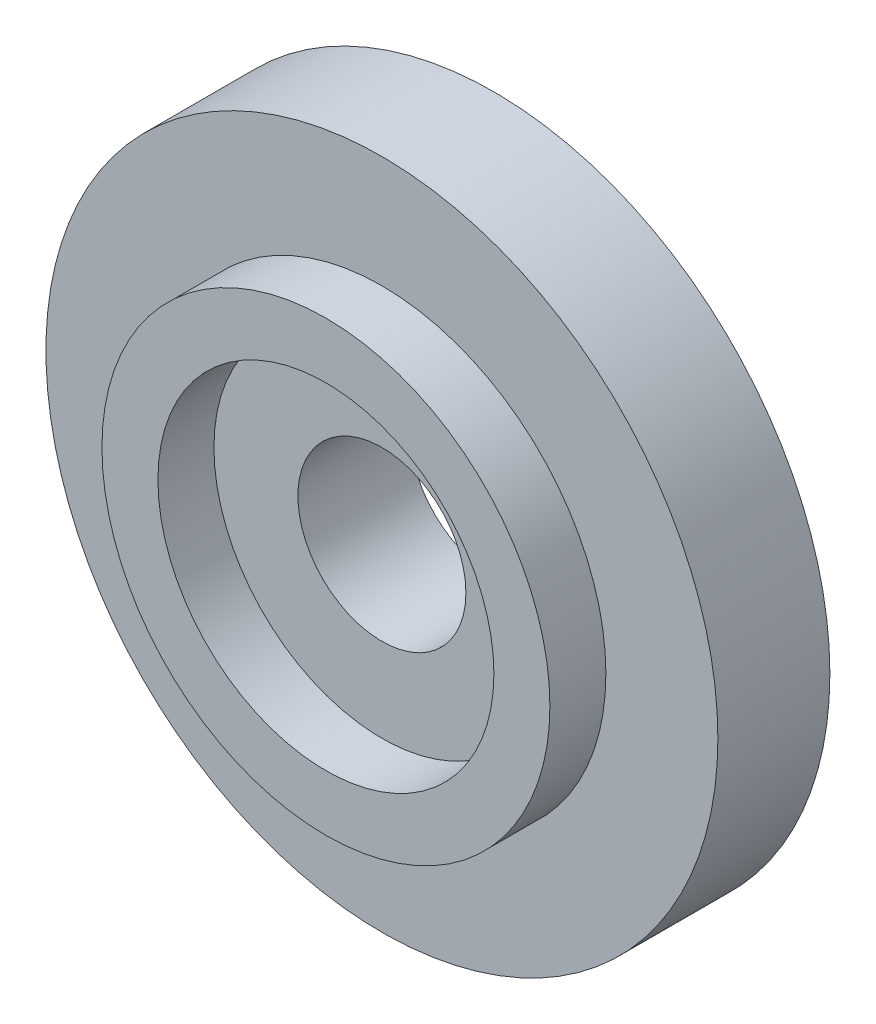
ISO-10303-21;
HEADER;
FILE_DESCRIPTION(('STEP AP214'),'2;1');
FILE_NAME('part.step','',(''),(''),'','','');
FILE_SCHEMA(('AUTOMOTIVE_DESIGN { 1 0 10303 214 1 1 1 1 }'));
ENDSEC;
DATA;
#1=APPLICATION_CONTEXT('core data for automotive mechanical design processes');
#2=APPLICATION_PROTOCOL_DEFINITION('international standard','automotive_design',2000,#1);
#3=PRODUCT_CONTEXT('',#1,'mechanical');
#4=PRODUCT('Part','Part','',(#3));
#5=PRODUCT_RELATED_PRODUCT_CATEGORY('part','',(#4));
#6=PRODUCT_DEFINITION_FORMATION('','',#4);
#7=PRODUCT_DEFINITION_CONTEXT('part definition',#1,'design');
#8=PRODUCT_DEFINITION('design','',#6,#7);
#9=PRODUCT_DEFINITION_SHAPE('','',#8);
#10=(LENGTH_UNIT() NAMED_UNIT(*) SI_UNIT(.MILLI.,.METRE.));
#11=(NAMED_UNIT(*) PLANE_ANGLE_UNIT() SI_UNIT($,.RADIAN.));
#12=(NAMED_UNIT(*) SI_UNIT($,.STERADIAN.) SOLID_ANGLE_UNIT());
#13=UNCERTAINTY_MEASURE_WITH_UNIT(LENGTH_MEASURE(1.E-05),#10,'distance_accuracy_value','');
#14=(GEOMETRIC_REPRESENTATION_CONTEXT(3) GLOBAL_UNCERTAINTY_ASSIGNED_CONTEXT((#13)) GLOBAL_UNIT_ASSIGNED_CONTEXT((#10,
#11,#12)) REPRESENTATION_CONTEXT('',''));
#15=CARTESIAN_POINT('',(0.,0.,0.));
#16=DIRECTION('',(0.,0.,1.));
#17=DIRECTION('',(1.,0.,0.));
#18=AXIS2_PLACEMENT_3D('',#15,#16,#17);
#19=CARTESIAN_POINT('',(0.,0.,2.));
#20=DIRECTION('',(0.,0.,1.));
#21=DIRECTION('',(1.,0.,0.));
#22=AXIS2_PLACEMENT_3D('',#19,#20,#21);
#23=PLANE('',#22);
#24=CARTESIAN_POINT('',(0.,0.,2.));
#25=DIRECTION('',(0.,0.,1.));
#26=DIRECTION('',(1.,0.,0.));
#27=AXIS2_PLACEMENT_3D('',#24,#25,#26);
#28=CIRCLE('',#27,6.);
#29=CARTESIAN_POINT('',(6.,0.,2.));
#30=VERTEX_POINT('',#29);
#31=EDGE_CURVE('E40',#30,#30,#28,.T.);
#32=ORIENTED_EDGE('',*,*,#31,.T.);
#33=EDGE_LOOP('',(#32));
#34=FACE_BOUND('',#33,.T.);
#35=CARTESIAN_POINT('',(0.,0.,2.));
#36=DIRECTION('',(0.,0.,1.));
#37=DIRECTION('',(1.,0.,0.));
#38=AXIS2_PLACEMENT_3D('',#35,#36,#37);
#39=CIRCLE('',#38,4.);
#40=CARTESIAN_POINT('',(4.,0.,2.));
#41=VERTEX_POINT('',#40);
#42=EDGE_CURVE('E57',#41,#41,#39,.T.);
#43=ORIENTED_EDGE('',*,*,#42,.F.);
#44=EDGE_LOOP('',(#43));
#45=FACE_BOUND('',#44,.T.);
#46=ADVANCED_FACE('F33',(#34,#45),#23,.T.);
#47=CARTESIAN_POINT('',(0.,0.,2.));
#48=DIRECTION('',(0.,0.,1.));
#49=DIRECTION('',(1.,0.,0.));
#50=AXIS2_PLACEMENT_3D('',#47,#48,#49);
#51=CIRCLE('',#50,3.);
#52=CARTESIAN_POINT('',(3.,0.,2.));
#53=VERTEX_POINT('',#52);
#54=EDGE_CURVE('E10',#53,#53,#51,.F.);
#55=ORIENTED_EDGE('',*,*,#54,.F.);
#56=EDGE_LOOP('',(#55));
#57=FACE_BOUND('',#56,.T.);
#58=CARTESIAN_POINT('',(0.,0.,2.));
#59=DIRECTION('',(0.,0.,1.));
#60=DIRECTION('',(1.,0.,0.));
#61=AXIS2_PLACEMENT_3D('',#58,#59,#60);
#62=CIRCLE('',#61,1.5);
#63=CARTESIAN_POINT('',(1.5,0.,2.));
#64=VERTEX_POINT('',#63);
#65=EDGE_CURVE('E49',#64,#64,#62,.T.);
#66=ORIENTED_EDGE('',*,*,#65,.F.);
#67=EDGE_LOOP('',(#66));
#68=FACE_BOUND('',#67,.T.);
#69=ADVANCED_FACE('F84',(#57,#68),#23,.T.);
#70=CARTESIAN_POINT('',(0.,0.,0.));
#71=DIRECTION('',(0.,0.,1.));
#72=DIRECTION('',(1.,0.,0.));
#73=AXIS2_PLACEMENT_3D('',#70,#71,#72);
#74=PLANE('',#73);
#75=CARTESIAN_POINT('',(0.,0.,0.));
#76=DIRECTION('',(0.,0.,1.));
#77=DIRECTION('',(1.,0.,0.));
#78=AXIS2_PLACEMENT_3D('',#75,#76,#77);
#79=CIRCLE('',#78,6.);
#80=CARTESIAN_POINT('',(6.,0.,0.));
#81=VERTEX_POINT('',#80);
#82=EDGE_CURVE('E44',#81,#81,#79,.T.);
#83=ORIENTED_EDGE('',*,*,#82,.F.);
#84=EDGE_LOOP('',(#83));
#85=FACE_BOUND('',#84,.T.);
#86=CARTESIAN_POINT('',(0.,0.,0.));
#87=DIRECTION('',(0.,0.,1.));
#88=DIRECTION('',(1.,0.,0.));
#89=AXIS2_PLACEMENT_3D('',#86,#87,#88);
#90=CIRCLE('',#89,1.5);
#91=CARTESIAN_POINT('',(1.5,0.,0.));
#92=VERTEX_POINT('',#91);
#93=EDGE_CURVE('E51',#92,#92,#90,.T.);
#94=ORIENTED_EDGE('',*,*,#93,.T.);
#95=EDGE_LOOP('',(#94));
#96=FACE_BOUND('',#95,.T.);
#97=ADVANCED_FACE('F89',(#85,#96),#74,.F.);
#98=CARTESIAN_POINT('',(0.,0.,2.));
#99=DIRECTION('',(0.,0.,-1.));
#100=DIRECTION('',(-1.,0.,0.));
#101=AXIS2_PLACEMENT_3D('',#98,#99,#100);
#102=CYLINDRICAL_SURFACE('',#101,6.);
#103=ORIENTED_EDGE('',*,*,#31,.F.);
#104=EDGE_LOOP('',(#103));
#105=FACE_BOUND('',#104,.T.);
#106=ORIENTED_EDGE('',*,*,#82,.T.);
#107=EDGE_LOOP('',(#106));
#108=FACE_BOUND('',#107,.T.);
#109=ADVANCED_FACE('F35',(#105,#108),#102,.T.);
#110=CARTESIAN_POINT('',(0.,0.,2.));
#111=DIRECTION('',(0.,0.,-1.));
#112=DIRECTION('',(-1.,0.,0.));
#113=AXIS2_PLACEMENT_3D('',#110,#111,#112);
#114=CYLINDRICAL_SURFACE('',#113,1.5);
#115=ORIENTED_EDGE('',*,*,#65,.T.);
#116=EDGE_LOOP('',(#115));
#117=FACE_BOUND('',#116,.T.);
#118=ORIENTED_EDGE('',*,*,#93,.F.);
#119=EDGE_LOOP('',(#118));
#120=FACE_BOUND('',#119,.T.);
#121=ADVANCED_FACE('F71',(#117,#120),#114,.F.);
#122=CARTESIAN_POINT('',(0.,0.,3.));
#123=DIRECTION('',(0.,0.,1.));
#124=DIRECTION('',(1.,0.,0.));
#125=AXIS2_PLACEMENT_3D('',#122,#123,#124);
#126=PLANE('',#125);
#127=CARTESIAN_POINT('',(0.,0.,3.));
#128=DIRECTION('',(0.,0.,1.));
#129=DIRECTION('',(1.,0.,0.));
#130=AXIS2_PLACEMENT_3D('',#127,#128,#129);
#131=CIRCLE('',#130,4.);
#132=CARTESIAN_POINT('',(4.,0.,3.));
#133=VERTEX_POINT('',#132);
#134=EDGE_CURVE('E54',#133,#133,#131,.T.);
#135=ORIENTED_EDGE('',*,*,#134,.T.);
#136=EDGE_LOOP('',(#135));
#137=FACE_BOUND('',#136,.T.);
#138=CARTESIAN_POINT('',(0.,0.,3.));
#139=DIRECTION('',(0.,0.,1.));
#140=DIRECTION('',(1.,0.,0.));
#141=AXIS2_PLACEMENT_3D('',#138,#139,#140);
#142=CIRCLE('',#141,3.);
#143=CARTESIAN_POINT('',(3.,0.,3.));
#144=VERTEX_POINT('',#143);
#145=EDGE_CURVE('E60',#144,#144,#142,.T.);
#146=ORIENTED_EDGE('',*,*,#145,.F.);
#147=EDGE_LOOP('',(#146));
#148=FACE_BOUND('',#147,.T.);
#149=ADVANCED_FACE('F68',(#137,#148),#126,.T.);
#150=CARTESIAN_POINT('',(0.,0.,3.));
#151=DIRECTION('',(0.,0.,-1.));
#152=DIRECTION('',(-1.,0.,0.));
#153=AXIS2_PLACEMENT_3D('',#150,#151,#152);
#154=CYLINDRICAL_SURFACE('',#153,4.);
#155=ORIENTED_EDGE('',*,*,#134,.F.);
#156=EDGE_LOOP('',(#155));
#157=FACE_BOUND('',#156,.T.);
#158=ORIENTED_EDGE('',*,*,#42,.T.);
#159=EDGE_LOOP('',(#158));
#160=FACE_BOUND('',#159,.T.);
#161=ADVANCED_FACE('F70',(#157,#160),#154,.T.);
#162=CARTESIAN_POINT('',(0.,0.,3.));
#163=DIRECTION('',(0.,0.,-1.));
#164=DIRECTION('',(-1.,0.,0.));
#165=AXIS2_PLACEMENT_3D('',#162,#163,#164);
#166=CYLINDRICAL_SURFACE('',#165,3.);
#167=ORIENTED_EDGE('',*,*,#145,.T.);
#168=EDGE_LOOP('',(#167));
#169=FACE_BOUND('',#168,.T.);
#170=ORIENTED_EDGE('',*,*,#54,.T.);
#171=EDGE_LOOP('',(#170));
#172=FACE_BOUND('',#171,.T.);
#173=ADVANCED_FACE('F66',(#169,#172),#166,.F.);
#174=CLOSED_SHELL('',(#46,#69,#97,#109,#121,#149,#161,#173));
#175=MANIFOLD_SOLID_BREP('B2',#174);
#176=ADVANCED_BREP_SHAPE_REPRESENTATION('',(#18,#175),#14);
#177=SHAPE_DEFINITION_REPRESENTATION(#9,#176);
ENDSEC;
END-ISO-10303-21;
